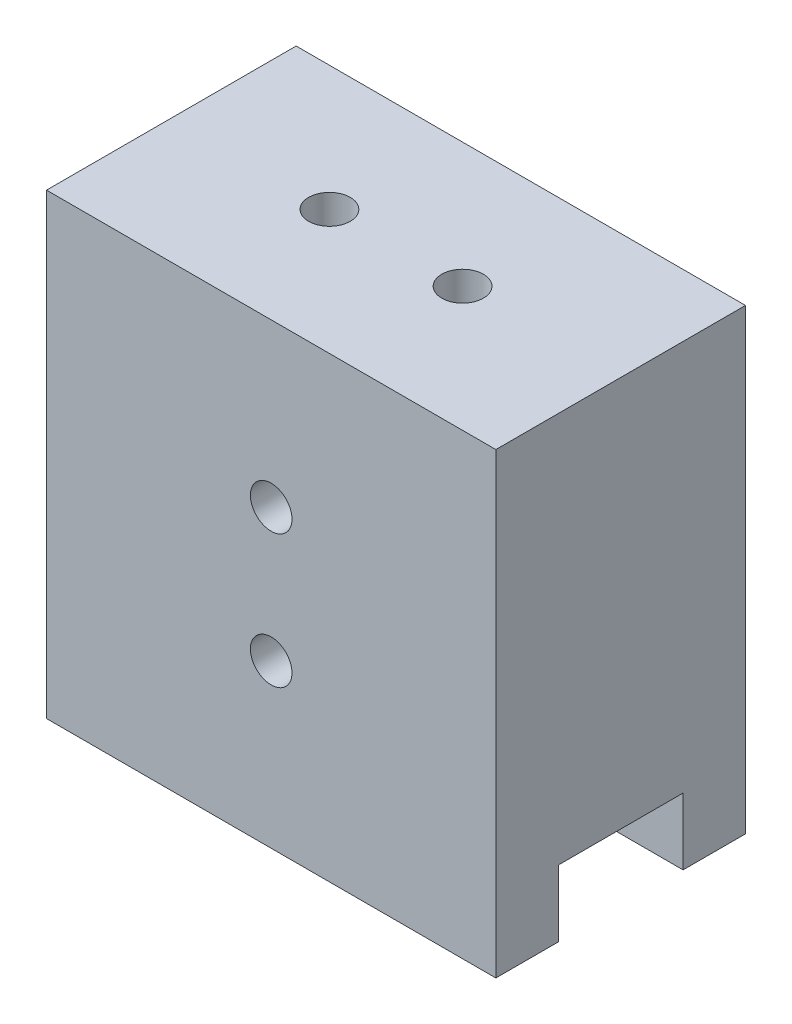
ISO-10303-21;
HEADER;
FILE_DESCRIPTION(('STEP AP214'),'2;1');
FILE_NAME('part.step','',(''),(''),'','','');
FILE_SCHEMA(('AUTOMOTIVE_DESIGN { 1 0 10303 214 1 1 1 1 }'));
ENDSEC;
DATA;
#1=APPLICATION_CONTEXT('core data for automotive mechanical design processes');
#2=APPLICATION_PROTOCOL_DEFINITION('international standard','automotive_design',2000,#1);
#3=PRODUCT_CONTEXT('',#1,'mechanical');
#4=PRODUCT('Part','Part','',(#3));
#5=PRODUCT_RELATED_PRODUCT_CATEGORY('part','',(#4));
#6=PRODUCT_DEFINITION_FORMATION('','',#4);
#7=PRODUCT_DEFINITION_CONTEXT('part definition',#1,'design');
#8=PRODUCT_DEFINITION('design','',#6,#7);
#9=PRODUCT_DEFINITION_SHAPE('','',#8);
#10=(LENGTH_UNIT() NAMED_UNIT(*) SI_UNIT(.MILLI.,.METRE.));
#11=(NAMED_UNIT(*) PLANE_ANGLE_UNIT() SI_UNIT($,.RADIAN.));
#12=(NAMED_UNIT(*) SI_UNIT($,.STERADIAN.) SOLID_ANGLE_UNIT());
#13=UNCERTAINTY_MEASURE_WITH_UNIT(LENGTH_MEASURE(1.E-05),#10,'distance_accuracy_value','');
#14=(GEOMETRIC_REPRESENTATION_CONTEXT(3) GLOBAL_UNCERTAINTY_ASSIGNED_CONTEXT((#13)) GLOBAL_UNIT_ASSIGNED_CONTEXT((#10,
#11,#12)) REPRESENTATION_CONTEXT('',''));
#15=CARTESIAN_POINT('',(0.,0.,0.));
#16=DIRECTION('',(0.,0.,1.));
#17=DIRECTION('',(1.,0.,0.));
#18=AXIS2_PLACEMENT_3D('',#15,#16,#17);
#19=CARTESIAN_POINT('',(0.,0.,30.));
#20=DIRECTION('',(0.,1.,0.));
#21=DIRECTION('',(0.,0.,1.));
#22=AXIS2_PLACEMENT_3D('',#19,#20,#21);
#23=PLANE('',#22);
#24=DIRECTION('',(0.,0.,-1.));
#25=VECTOR('',#24,1.);
#26=CARTESIAN_POINT('',(54.,0.,30.));
#27=LINE('',#26,#25);
#28=CARTESIAN_POINT('',(54.,0.,7.5));
#29=VERTEX_POINT('',#28);
#30=CARTESIAN_POINT('',(54.,0.,0.));
#31=VERTEX_POINT('',#30);
#32=EDGE_CURVE('E161',#29,#31,#27,.T.);
#33=ORIENTED_EDGE('',*,*,#32,.F.);
#34=DIRECTION('',(1.,0.,0.));
#35=VECTOR('',#34,1.);
#36=CARTESIAN_POINT('',(0.,0.,7.5));
#37=LINE('',#36,#35);
#38=CARTESIAN_POINT('',(0.,0.,7.5));
#39=VERTEX_POINT('',#38);
#40=EDGE_CURVE('E130',#39,#29,#37,.T.);
#41=ORIENTED_EDGE('',*,*,#40,.F.);
#42=DIRECTION('',(0.,0.,-1.));
#43=VECTOR('',#42,1.);
#44=CARTESIAN_POINT('',(0.,0.,30.));
#45=LINE('',#44,#43);
#46=CARTESIAN_POINT('',(0.,0.,0.));
#47=VERTEX_POINT('',#46);
#48=EDGE_CURVE('E49',#39,#47,#45,.T.);
#49=ORIENTED_EDGE('',*,*,#48,.T.);
#50=DIRECTION('',(1.,0.,0.));
#51=VECTOR('',#50,1.);
#52=CARTESIAN_POINT('',(0.,0.,0.));
#53=LINE('',#52,#51);
#54=EDGE_CURVE('E152',#47,#31,#53,.T.);
#55=ORIENTED_EDGE('',*,*,#54,.T.);
#56=EDGE_LOOP('',(#33,#41,#49,#55));
#57=FACE_BOUND('',#56,.T.);
#58=ADVANCED_FACE('F41',(#57),#23,.F.);
#59=CARTESIAN_POINT('',(0.,0.,30.));
#60=DIRECTION('',(1.,0.,0.));
#61=DIRECTION('',(0.,0.,-1.));
#62=AXIS2_PLACEMENT_3D('',#59,#60,#61);
#63=PLANE('',#62);
#64=ORIENTED_EDGE('',*,*,#48,.F.);
#65=DIRECTION('',(0.,-1.,0.));
#66=VECTOR('',#65,1.);
#67=CARTESIAN_POINT('',(0.,8.,7.5));
#68=LINE('',#67,#66);
#69=CARTESIAN_POINT('',(0.,8.,7.5));
#70=VERTEX_POINT('',#69);
#71=EDGE_CURVE('E137',#70,#39,#68,.T.);
#72=ORIENTED_EDGE('',*,*,#71,.F.);
#73=DIRECTION('',(0.,0.,-1.));
#74=VECTOR('',#73,1.);
#75=CARTESIAN_POINT('',(0.,8.,22.5));
#76=LINE('',#75,#74);
#77=CARTESIAN_POINT('',(0.,8.,22.5));
#78=VERTEX_POINT('',#77);
#79=EDGE_CURVE('E123',#78,#70,#76,.T.);
#80=ORIENTED_EDGE('',*,*,#79,.F.);
#81=DIRECTION('',(0.,-1.,0.));
#82=VECTOR('',#81,1.);
#83=CARTESIAN_POINT('',(0.,8.,22.5));
#84=LINE('',#83,#82);
#85=CARTESIAN_POINT('',(0.,0.,22.5));
#86=VERTEX_POINT('',#85);
#87=EDGE_CURVE('E121',#78,#86,#84,.T.);
#88=ORIENTED_EDGE('',*,*,#87,.T.);
#89=CARTESIAN_POINT('',(0.,0.,30.));
#90=VERTEX_POINT('',#89);
#91=EDGE_CURVE('E11',#90,#86,#45,.T.);
#92=ORIENTED_EDGE('',*,*,#91,.F.);
#93=DIRECTION('',(0.,-1.,0.));
#94=VECTOR('',#93,1.);
#95=CARTESIAN_POINT('',(0.,0.,30.));
#96=LINE('',#95,#94);
#97=CARTESIAN_POINT('',(0.,55.,30.));
#98=VERTEX_POINT('',#97);
#99=EDGE_CURVE('E142',#98,#90,#96,.T.);
#100=ORIENTED_EDGE('',*,*,#99,.F.);
#101=DIRECTION('',(0.,0.,-1.));
#102=VECTOR('',#101,1.);
#103=CARTESIAN_POINT('',(0.,55.,30.));
#104=LINE('',#103,#102);
#105=CARTESIAN_POINT('',(0.,55.,0.));
#106=VERTEX_POINT('',#105);
#107=EDGE_CURVE('E148',#98,#106,#104,.T.);
#108=ORIENTED_EDGE('',*,*,#107,.T.);
#109=DIRECTION('',(0.,-1.,0.));
#110=VECTOR('',#109,1.);
#111=CARTESIAN_POINT('',(0.,0.,0.));
#112=LINE('',#111,#110);
#113=EDGE_CURVE('E149',#106,#47,#112,.T.);
#114=ORIENTED_EDGE('',*,*,#113,.T.);
#115=EDGE_LOOP('',(#64,#72,#80,#88,#92,#100,#108,#114));
#116=FACE_BOUND('',#115,.T.);
#117=ADVANCED_FACE('F43',(#116),#63,.F.);
#118=ORIENTED_EDGE('',*,*,#91,.T.);
#119=DIRECTION('',(-1.,0.,0.));
#120=VECTOR('',#119,1.);
#121=CARTESIAN_POINT('',(0.,0.,22.5));
#122=LINE('',#121,#120);
#123=CARTESIAN_POINT('',(54.,0.,22.5));
#124=VERTEX_POINT('',#123);
#125=EDGE_CURVE('E179',#124,#86,#122,.T.);
#126=ORIENTED_EDGE('',*,*,#125,.F.);
#127=CARTESIAN_POINT('',(54.,0.,30.));
#128=VERTEX_POINT('',#127);
#129=EDGE_CURVE('E135',#128,#124,#27,.T.);
#130=ORIENTED_EDGE('',*,*,#129,.F.);
#131=DIRECTION('',(1.,0.,0.));
#132=VECTOR('',#131,1.);
#133=CARTESIAN_POINT('',(0.,0.,30.));
#134=LINE('',#133,#132);
#135=EDGE_CURVE('E93',#90,#128,#134,.T.);
#136=ORIENTED_EDGE('',*,*,#135,.F.);
#137=EDGE_LOOP('',(#118,#126,#130,#136));
#138=FACE_BOUND('',#137,.T.);
#139=ADVANCED_FACE('F178',(#138),#23,.F.);
#140=CARTESIAN_POINT('',(54.,0.,30.));
#141=DIRECTION('',(-1.,0.,0.));
#142=DIRECTION('',(0.,0.,1.));
#143=AXIS2_PLACEMENT_3D('',#140,#141,#142);
#144=PLANE('',#143);
#145=DIRECTION('',(0.,0.,1.));
#146=VECTOR('',#145,1.);
#147=CARTESIAN_POINT('',(54.,8.,22.5));
#148=LINE('',#147,#146);
#149=CARTESIAN_POINT('',(54.,8.,7.5));
#150=VERTEX_POINT('',#149);
#151=CARTESIAN_POINT('',(54.,8.,22.5));
#152=VERTEX_POINT('',#151);
#153=EDGE_CURVE('E124',#150,#152,#148,.T.);
#154=ORIENTED_EDGE('',*,*,#153,.F.);
#155=DIRECTION('',(0.,-1.,0.));
#156=VECTOR('',#155,1.);
#157=CARTESIAN_POINT('',(54.,8.,7.5));
#158=LINE('',#157,#156);
#159=EDGE_CURVE('E153',#150,#29,#158,.T.);
#160=ORIENTED_EDGE('',*,*,#159,.T.);
#161=ORIENTED_EDGE('',*,*,#32,.T.);
#162=DIRECTION('',(0.,1.,0.));
#163=VECTOR('',#162,1.);
#164=CARTESIAN_POINT('',(54.,0.,0.));
#165=LINE('',#164,#163);
#166=CARTESIAN_POINT('',(54.,55.,0.));
#167=VERTEX_POINT('',#166);
#168=EDGE_CURVE('E156',#31,#167,#165,.T.);
#169=ORIENTED_EDGE('',*,*,#168,.T.);
#170=DIRECTION('',(0.,0.,-1.));
#171=VECTOR('',#170,1.);
#172=CARTESIAN_POINT('',(54.,55.,30.));
#173=LINE('',#172,#171);
#174=CARTESIAN_POINT('',(54.,55.,30.));
#175=VERTEX_POINT('',#174);
#176=EDGE_CURVE('E160',#175,#167,#173,.T.);
#177=ORIENTED_EDGE('',*,*,#176,.F.);
#178=DIRECTION('',(0.,1.,0.));
#179=VECTOR('',#178,1.);
#180=CARTESIAN_POINT('',(54.,0.,30.));
#181=LINE('',#180,#179);
#182=EDGE_CURVE('E145',#128,#175,#181,.T.);
#183=ORIENTED_EDGE('',*,*,#182,.F.);
#184=ORIENTED_EDGE('',*,*,#129,.T.);
#185=DIRECTION('',(0.,-1.,0.));
#186=VECTOR('',#185,1.);
#187=CARTESIAN_POINT('',(54.,8.,22.5));
#188=LINE('',#187,#186);
#189=EDGE_CURVE('E118',#152,#124,#188,.T.);
#190=ORIENTED_EDGE('',*,*,#189,.F.);
#191=EDGE_LOOP('',(#154,#160,#161,#169,#177,#183,#184,#190));
#192=FACE_BOUND('',#191,.T.);
#193=ADVANCED_FACE('F133',(#192),#144,.F.);
#194=CARTESIAN_POINT('',(0.,55.,30.));
#195=DIRECTION('',(0.,-1.,0.));
#196=DIRECTION('',(0.,0.,-1.));
#197=AXIS2_PLACEMENT_3D('',#194,#195,#196);
#198=PLANE('',#197);
#199=CARTESIAN_POINT('',(19.,55.,15.));
#200=DIRECTION('',(0.,1.,0.));
#201=DIRECTION('',(0.,0.,1.));
#202=AXIS2_PLACEMENT_3D('',#199,#200,#201);
#203=CIRCLE('',#202,2.5);
#204=CARTESIAN_POINT('',(19.,55.,17.5));
#205=VERTEX_POINT('',#204);
#206=EDGE_CURVE('E184',#205,#205,#203,.T.);
#207=ORIENTED_EDGE('',*,*,#206,.F.);
#208=EDGE_LOOP('',(#207));
#209=FACE_BOUND('',#208,.T.);
#210=CARTESIAN_POINT('',(35.,55.,15.));
#211=DIRECTION('',(0.,1.,0.));
#212=DIRECTION('',(0.,0.,1.));
#213=AXIS2_PLACEMENT_3D('',#210,#211,#212);
#214=CIRCLE('',#213,2.5);
#215=CARTESIAN_POINT('',(35.,55.,17.5));
#216=VERTEX_POINT('',#215);
#217=EDGE_CURVE('E194',#216,#216,#214,.T.);
#218=ORIENTED_EDGE('',*,*,#217,.F.);
#219=EDGE_LOOP('',(#218));
#220=FACE_BOUND('',#219,.T.);
#221=DIRECTION('',(-1.,0.,0.));
#222=VECTOR('',#221,1.);
#223=CARTESIAN_POINT('',(0.,55.,0.));
#224=LINE('',#223,#222);
#225=EDGE_CURVE('E86',#167,#106,#224,.T.);
#226=ORIENTED_EDGE('',*,*,#225,.T.);
#227=ORIENTED_EDGE('',*,*,#107,.F.);
#228=DIRECTION('',(-1.,0.,0.));
#229=VECTOR('',#228,1.);
#230=CARTESIAN_POINT('',(0.,55.,30.));
#231=LINE('',#230,#229);
#232=EDGE_CURVE('E65',#175,#98,#231,.T.);
#233=ORIENTED_EDGE('',*,*,#232,.F.);
#234=ORIENTED_EDGE('',*,*,#176,.T.);
#235=EDGE_LOOP('',(#226,#227,#233,#234));
#236=FACE_BOUND('',#235,.T.);
#237=ADVANCED_FACE('F176',(#209,#220,#236),#198,.F.);
#238=CARTESIAN_POINT('',(0.,0.,30.));
#239=DIRECTION('',(0.,0.,-1.));
#240=DIRECTION('',(-1.,0.,0.));
#241=AXIS2_PLACEMENT_3D('',#238,#239,#240);
#242=PLANE('',#241);
#243=CARTESIAN_POINT('',(27.,35.5,30.));
#244=DIRECTION('',(0.,0.,1.));
#245=DIRECTION('',(1.,0.,0.));
#246=AXIS2_PLACEMENT_3D('',#243,#244,#245);
#247=CIRCLE('',#246,2.5);
#248=CARTESIAN_POINT('',(29.5,35.5,30.));
#249=VERTEX_POINT('',#248);
#250=EDGE_CURVE('E206',#249,#249,#247,.T.);
#251=ORIENTED_EDGE('',*,*,#250,.F.);
#252=EDGE_LOOP('',(#251));
#253=FACE_BOUND('',#252,.T.);
#254=CARTESIAN_POINT('',(27.,19.5,30.));
#255=DIRECTION('',(0.,0.,1.));
#256=DIRECTION('',(1.,0.,0.));
#257=AXIS2_PLACEMENT_3D('',#254,#255,#256);
#258=CIRCLE('',#257,2.5);
#259=CARTESIAN_POINT('',(29.5,19.5,30.));
#260=VERTEX_POINT('',#259);
#261=EDGE_CURVE('E203',#260,#260,#258,.T.);
#262=ORIENTED_EDGE('',*,*,#261,.F.);
#263=EDGE_LOOP('',(#262));
#264=FACE_BOUND('',#263,.T.);
#265=ORIENTED_EDGE('',*,*,#99,.T.);
#266=ORIENTED_EDGE('',*,*,#135,.T.);
#267=ORIENTED_EDGE('',*,*,#182,.T.);
#268=ORIENTED_EDGE('',*,*,#232,.T.);
#269=EDGE_LOOP('',(#265,#266,#267,#268));
#270=FACE_BOUND('',#269,.T.);
#271=ADVANCED_FACE('F177',(#253,#264,#270),#242,.F.);
#272=CARTESIAN_POINT('',(0.,0.,0.));
#273=DIRECTION('',(0.,0.,-1.));
#274=DIRECTION('',(-1.,0.,0.));
#275=AXIS2_PLACEMENT_3D('',#272,#273,#274);
#276=PLANE('',#275);
#277=ORIENTED_EDGE('',*,*,#113,.F.);
#278=ORIENTED_EDGE('',*,*,#225,.F.);
#279=ORIENTED_EDGE('',*,*,#168,.F.);
#280=ORIENTED_EDGE('',*,*,#54,.F.);
#281=EDGE_LOOP('',(#277,#278,#279,#280));
#282=FACE_BOUND('',#281,.T.);
#283=ADVANCED_FACE('F171',(#282),#276,.T.);
#284=CARTESIAN_POINT('',(0.,8.,7.5));
#285=DIRECTION('',(0.,0.,-1.));
#286=DIRECTION('',(-1.,0.,0.));
#287=AXIS2_PLACEMENT_3D('',#284,#285,#286);
#288=PLANE('',#287);
#289=ORIENTED_EDGE('',*,*,#40,.T.);
#290=ORIENTED_EDGE('',*,*,#159,.F.);
#291=DIRECTION('',(1.,0.,0.));
#292=VECTOR('',#291,1.);
#293=CARTESIAN_POINT('',(0.,8.,7.5));
#294=LINE('',#293,#292);
#295=EDGE_CURVE('E56',#70,#150,#294,.T.);
#296=ORIENTED_EDGE('',*,*,#295,.F.);
#297=ORIENTED_EDGE('',*,*,#71,.T.);
#298=EDGE_LOOP('',(#289,#290,#296,#297));
#299=FACE_BOUND('',#298,.T.);
#300=ADVANCED_FACE('F189',(#299),#288,.F.);
#301=CARTESIAN_POINT('',(0.,8.,22.5));
#302=DIRECTION('',(0.,0.,1.));
#303=DIRECTION('',(1.,0.,0.));
#304=AXIS2_PLACEMENT_3D('',#301,#302,#303);
#305=PLANE('',#304);
#306=ORIENTED_EDGE('',*,*,#125,.T.);
#307=ORIENTED_EDGE('',*,*,#87,.F.);
#308=DIRECTION('',(-1.,0.,0.));
#309=VECTOR('',#308,1.);
#310=CARTESIAN_POINT('',(0.,8.,22.5));
#311=LINE('',#310,#309);
#312=EDGE_CURVE('E115',#152,#78,#311,.T.);
#313=ORIENTED_EDGE('',*,*,#312,.F.);
#314=ORIENTED_EDGE('',*,*,#189,.T.);
#315=EDGE_LOOP('',(#306,#307,#313,#314));
#316=FACE_BOUND('',#315,.T.);
#317=ADVANCED_FACE('F116',(#316),#305,.F.);
#318=CARTESIAN_POINT('',(0.,8.,0.));
#319=DIRECTION('',(0.,-1.,0.));
#320=DIRECTION('',(0.,0.,-1.));
#321=AXIS2_PLACEMENT_3D('',#318,#319,#320);
#322=PLANE('',#321);
#323=ORIENTED_EDGE('',*,*,#153,.T.);
#324=ORIENTED_EDGE('',*,*,#312,.T.);
#325=ORIENTED_EDGE('',*,*,#79,.T.);
#326=ORIENTED_EDGE('',*,*,#295,.T.);
#327=EDGE_LOOP('',(#323,#324,#325,#326));
#328=FACE_BOUND('',#327,.T.);
#329=ADVANCED_FACE('F127',(#328),#322,.T.);
#330=CARTESIAN_POINT('',(35.,45.,15.));
#331=DIRECTION('',(0.,1.,0.));
#332=DIRECTION('',(0.,0.,1.));
#333=AXIS2_PLACEMENT_3D('',#330,#331,#332);
#334=CYLINDRICAL_SURFACE('',#333,2.5);
#335=CARTESIAN_POINT('',(35.,45.,15.));
#336=DIRECTION('',(0.,1.,0.));
#337=DIRECTION('',(0.,0.,1.));
#338=AXIS2_PLACEMENT_3D('',#335,#336,#337);
#339=CIRCLE('',#338,2.5);
#340=CARTESIAN_POINT('',(35.,45.,17.5));
#341=VERTEX_POINT('',#340);
#342=EDGE_CURVE('E191',#341,#341,#339,.T.);
#343=ORIENTED_EDGE('',*,*,#342,.F.);
#344=EDGE_LOOP('',(#343));
#345=FACE_BOUND('',#344,.T.);
#346=ORIENTED_EDGE('',*,*,#217,.T.);
#347=EDGE_LOOP('',(#346));
#348=FACE_BOUND('',#347,.T.);
#349=ADVANCED_FACE('F264',(#345,#348),#334,.F.);
#350=CARTESIAN_POINT('',(35.,45.,15.));
#351=DIRECTION('',(0.,1.,0.));
#352=DIRECTION('',(0.,0.,1.));
#353=AXIS2_PLACEMENT_3D('',#350,#351,#352);
#354=PLANE('',#353);
#355=ORIENTED_EDGE('',*,*,#342,.T.);
#356=EDGE_LOOP('',(#355));
#357=FACE_BOUND('',#356,.T.);
#358=ADVANCED_FACE('F265',(#357),#354,.T.);
#359=CARTESIAN_POINT('',(19.,45.,15.));
#360=DIRECTION('',(0.,1.,0.));
#361=DIRECTION('',(0.,0.,1.));
#362=AXIS2_PLACEMENT_3D('',#359,#360,#361);
#363=CYLINDRICAL_SURFACE('',#362,2.5);
#364=CARTESIAN_POINT('',(19.,45.,15.));
#365=DIRECTION('',(0.,1.,0.));
#366=DIRECTION('',(0.,0.,1.));
#367=AXIS2_PLACEMENT_3D('',#364,#365,#366);
#368=CIRCLE('',#367,2.5);
#369=CARTESIAN_POINT('',(19.,45.,17.5));
#370=VERTEX_POINT('',#369);
#371=EDGE_CURVE('E180',#370,#370,#368,.T.);
#372=ORIENTED_EDGE('',*,*,#371,.F.);
#373=EDGE_LOOP('',(#372));
#374=FACE_BOUND('',#373,.T.);
#375=ORIENTED_EDGE('',*,*,#206,.T.);
#376=EDGE_LOOP('',(#375));
#377=FACE_BOUND('',#376,.T.);
#378=ADVANCED_FACE('F237',(#374,#377),#363,.F.);
#379=CARTESIAN_POINT('',(19.,45.,15.));
#380=DIRECTION('',(0.,1.,0.));
#381=DIRECTION('',(0.,0.,1.));
#382=AXIS2_PLACEMENT_3D('',#379,#380,#381);
#383=PLANE('',#382);
#384=ORIENTED_EDGE('',*,*,#371,.T.);
#385=EDGE_LOOP('',(#384));
#386=FACE_BOUND('',#385,.T.);
#387=ADVANCED_FACE('F228',(#386),#383,.T.);
#388=CARTESIAN_POINT('',(27.,19.5,20.));
#389=DIRECTION('',(0.,0.,1.));
#390=DIRECTION('',(1.,0.,0.));
#391=AXIS2_PLACEMENT_3D('',#388,#389,#390);
#392=CYLINDRICAL_SURFACE('',#391,2.5);
#393=CARTESIAN_POINT('',(27.,19.5,20.));
#394=DIRECTION('',(0.,0.,1.));
#395=DIRECTION('',(1.,0.,0.));
#396=AXIS2_PLACEMENT_3D('',#393,#394,#395);
#397=CIRCLE('',#396,2.5);
#398=CARTESIAN_POINT('',(29.5,19.5,20.));
#399=VERTEX_POINT('',#398);
#400=EDGE_CURVE('E200',#399,#399,#397,.T.);
#401=ORIENTED_EDGE('',*,*,#400,.F.);
#402=EDGE_LOOP('',(#401));
#403=FACE_BOUND('',#402,.T.);
#404=ORIENTED_EDGE('',*,*,#261,.T.);
#405=EDGE_LOOP('',(#404));
#406=FACE_BOUND('',#405,.T.);
#407=ADVANCED_FACE('F226',(#403,#406),#392,.F.);
#408=CARTESIAN_POINT('',(27.,19.5,20.));
#409=DIRECTION('',(0.,0.,1.));
#410=DIRECTION('',(1.,0.,0.));
#411=AXIS2_PLACEMENT_3D('',#408,#409,#410);
#412=PLANE('',#411);
#413=ORIENTED_EDGE('',*,*,#400,.T.);
#414=EDGE_LOOP('',(#413));
#415=FACE_BOUND('',#414,.T.);
#416=ADVANCED_FACE('F217',(#415),#412,.T.);
#417=CARTESIAN_POINT('',(27.,35.5,20.));
#418=DIRECTION('',(0.,0.,1.));
#419=DIRECTION('',(1.,0.,0.));
#420=AXIS2_PLACEMENT_3D('',#417,#418,#419);
#421=CYLINDRICAL_SURFACE('',#420,2.5);
#422=CARTESIAN_POINT('',(27.,35.5,20.));
#423=DIRECTION('',(0.,0.,1.));
#424=DIRECTION('',(1.,0.,0.));
#425=AXIS2_PLACEMENT_3D('',#422,#423,#424);
#426=CIRCLE('',#425,2.5);
#427=CARTESIAN_POINT('',(29.5,35.5,20.));
#428=VERTEX_POINT('',#427);
#429=EDGE_CURVE('E195',#428,#428,#426,.T.);
#430=ORIENTED_EDGE('',*,*,#429,.F.);
#431=EDGE_LOOP('',(#430));
#432=FACE_BOUND('',#431,.T.);
#433=ORIENTED_EDGE('',*,*,#250,.T.);
#434=EDGE_LOOP('',(#433));
#435=FACE_BOUND('',#434,.T.);
#436=ADVANCED_FACE('F214',(#432,#435),#421,.F.);
#437=CARTESIAN_POINT('',(27.,35.5,20.));
#438=DIRECTION('',(0.,0.,1.));
#439=DIRECTION('',(1.,0.,0.));
#440=AXIS2_PLACEMENT_3D('',#437,#438,#439);
#441=PLANE('',#440);
#442=ORIENTED_EDGE('',*,*,#429,.T.);
#443=EDGE_LOOP('',(#442));
#444=FACE_BOUND('',#443,.T.);
#445=ADVANCED_FACE('F212',(#444),#441,.T.);
#446=CLOSED_SHELL('',(#58,#117,#139,#193,#237,#271,#283,#300,#317,#329,#349,#358,#378,#387,#407,
#416,#436,#445));
#447=MANIFOLD_SOLID_BREP('B2',#446);
#448=ADVANCED_BREP_SHAPE_REPRESENTATION('',(#18,#447),#14);
#449=SHAPE_DEFINITION_REPRESENTATION(#9,#448);
ENDSEC;
END-ISO-10303-21;
